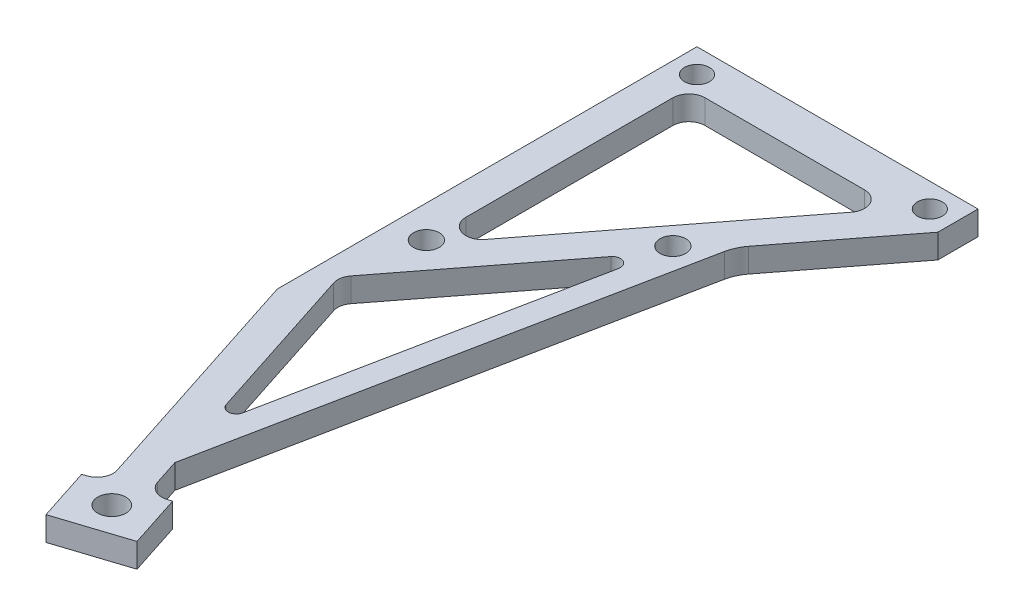
ISO-10303-21;
HEADER;
FILE_DESCRIPTION(('STEP AP214'),'2;1');
FILE_NAME('part.step','',(''),(''),'','','');
FILE_SCHEMA(('AUTOMOTIVE_DESIGN { 1 0 10303 214 1 1 1 1 }'));
ENDSEC;
DATA;
#1=APPLICATION_CONTEXT('core data for automotive mechanical design processes');
#2=APPLICATION_PROTOCOL_DEFINITION('international standard','automotive_design',2000,#1);
#3=PRODUCT_CONTEXT('',#1,'mechanical');
#4=PRODUCT('Part','Part','',(#3));
#5=PRODUCT_RELATED_PRODUCT_CATEGORY('part','',(#4));
#6=PRODUCT_DEFINITION_FORMATION('','',#4);
#7=PRODUCT_DEFINITION_CONTEXT('part definition',#1,'design');
#8=PRODUCT_DEFINITION('design','',#6,#7);
#9=PRODUCT_DEFINITION_SHAPE('','',#8);
#10=(LENGTH_UNIT() NAMED_UNIT(*) SI_UNIT(.MILLI.,.METRE.));
#11=(NAMED_UNIT(*) PLANE_ANGLE_UNIT() SI_UNIT($,.RADIAN.));
#12=(NAMED_UNIT(*) SI_UNIT($,.STERADIAN.) SOLID_ANGLE_UNIT());
#13=UNCERTAINTY_MEASURE_WITH_UNIT(LENGTH_MEASURE(1.E-05),#10,'distance_accuracy_value','');
#14=(GEOMETRIC_REPRESENTATION_CONTEXT(3) GLOBAL_UNCERTAINTY_ASSIGNED_CONTEXT((#13)) GLOBAL_UNIT_ASSIGNED_CONTEXT((#10,
#11,#12)) REPRESENTATION_CONTEXT('',''));
#15=CARTESIAN_POINT('',(0.,0.,0.));
#16=DIRECTION('',(0.,0.,1.));
#17=DIRECTION('',(1.,0.,0.));
#18=AXIS2_PLACEMENT_3D('',#15,#16,#17);
#19=CARTESIAN_POINT('',(50.,0.,4.));
#20=DIRECTION('',(-1.,0.,0.));
#21=DIRECTION('',(0.,0.,1.));
#22=AXIS2_PLACEMENT_3D('',#19,#20,#21);
#23=PLANE('',#22);
#24=DIRECTION('',(0.,0.,1.));
#25=VECTOR('',#24,1.);
#26=CARTESIAN_POINT('',(50.,-5.99999999999999,0.));
#27=LINE('',#26,#25);
#28=CARTESIAN_POINT('',(50.,-5.99999999999999,0.));
#29=VERTEX_POINT('',#28);
#30=CARTESIAN_POINT('',(50.,-5.99999999999999,5.));
#31=VERTEX_POINT('',#30);
#32=EDGE_CURVE('E520',#29,#31,#27,.T.);
#33=ORIENTED_EDGE('',*,*,#32,.F.);
#34=DIRECTION('',(0.,1.,0.));
#35=VECTOR('',#34,1.);
#36=CARTESIAN_POINT('',(50.,-7.001,0.));
#37=LINE('',#36,#35);
#38=CARTESIAN_POINT('',(50.,-3.,0.));
#39=VERTEX_POINT('',#38);
#40=EDGE_CURVE('E571',#29,#39,#37,.T.);
#41=ORIENTED_EDGE('',*,*,#40,.T.);
#42=DIRECTION('',(0.,0.,-1.));
#43=VECTOR('',#42,1.);
#44=CARTESIAN_POINT('',(50.,-3.,3.));
#45=LINE('',#44,#43);
#46=CARTESIAN_POINT('',(50.,-3.,5.));
#47=VERTEX_POINT('',#46);
#48=EDGE_CURVE('E510',#47,#39,#45,.T.);
#49=ORIENTED_EDGE('',*,*,#48,.F.);
#50=DIRECTION('',(0.,1.,0.));
#51=VECTOR('',#50,1.);
#52=CARTESIAN_POINT('',(50.,-25.,5.));
#53=LINE('',#52,#51);
#54=EDGE_CURVE('E508',#31,#47,#53,.T.);
#55=ORIENTED_EDGE('',*,*,#54,.F.);
#56=EDGE_LOOP('',(#33,#41,#49,#55));
#57=FACE_BOUND('',#56,.T.);
#58=ADVANCED_FACE('F224',(#57),#23,.F.);
#59=CARTESIAN_POINT('',(15.,0.,0.));
#60=DIRECTION('',(1.,0.,0.));
#61=DIRECTION('',(0.,0.,-1.));
#62=AXIS2_PLACEMENT_3D('',#59,#60,#61);
#63=PLANE('',#62);
#64=DIRECTION('',(0.,0.,-1.));
#65=VECTOR('',#64,1.);
#66=CARTESIAN_POINT('',(15.,-6.,52.2716704370543));
#67=LINE('',#66,#65);
#68=CARTESIAN_POINT('',(15.,-6.,52.2716704370543));
#69=VERTEX_POINT('',#68);
#70=CARTESIAN_POINT('',(15.,-6.,0.));
#71=VERTEX_POINT('',#70);
#72=EDGE_CURVE('E406',#69,#71,#67,.T.);
#73=ORIENTED_EDGE('',*,*,#72,.F.);
#74=DIRECTION('',(0.,1.,0.));
#75=VECTOR('',#74,1.);
#76=CARTESIAN_POINT('',(15.,0.,52.2716704370543));
#77=LINE('',#76,#75);
#78=CARTESIAN_POINT('',(15.,-3.00000000000001,52.2716704370543));
#79=VERTEX_POINT('',#78);
#80=EDGE_CURVE('E419',#69,#79,#77,.T.);
#81=ORIENTED_EDGE('',*,*,#80,.T.);
#82=DIRECTION('',(0.,0.,-1.));
#83=VECTOR('',#82,1.);
#84=CARTESIAN_POINT('',(15.,-3.,0.));
#85=LINE('',#84,#83);
#86=CARTESIAN_POINT('',(15.,-3.,0.));
#87=VERTEX_POINT('',#86);
#88=EDGE_CURVE('E569',#79,#87,#85,.T.);
#89=ORIENTED_EDGE('',*,*,#88,.T.);
#90=DIRECTION('',(0.,1.,0.));
#91=VECTOR('',#90,1.);
#92=CARTESIAN_POINT('',(15.,-7.00100000000001,0.));
#93=LINE('',#92,#91);
#94=EDGE_CURVE('E421',#71,#87,#93,.T.);
#95=ORIENTED_EDGE('',*,*,#94,.F.);
#96=EDGE_LOOP('',(#73,#81,#89,#95));
#97=FACE_BOUND('',#96,.T.);
#98=ADVANCED_FACE('F417',(#97),#63,.F.);
#99=CARTESIAN_POINT('',(19.,-25.,37.7023454364812));
#100=DIRECTION('',(0.,1.,0.));
#101=DIRECTION('',(0.,0.,1.));
#102=AXIS2_PLACEMENT_3D('',#99,#100,#101);
#103=CYLINDRICAL_SURFACE('',#102,1.6);
#104=CARTESIAN_POINT('',(19.,-3.,37.7023454364812));
#105=DIRECTION('',(0.,-1.,0.));
#106=DIRECTION('',(0.,0.,-1.));
#107=AXIS2_PLACEMENT_3D('',#104,#105,#106);
#108=CIRCLE('',#107,1.6);
#109=CARTESIAN_POINT('',(19.,-3.,36.1023454364812));
#110=VERTEX_POINT('',#109);
#111=EDGE_CURVE('E624',#110,#110,#108,.T.);
#112=ORIENTED_EDGE('',*,*,#111,.F.);
#113=EDGE_LOOP('',(#112));
#114=FACE_BOUND('',#113,.T.);
#115=CARTESIAN_POINT('',(19.,-6.,37.7023454364812));
#116=DIRECTION('',(0.,-1.,0.));
#117=DIRECTION('',(1.,0.,0.));
#118=AXIS2_PLACEMENT_3D('',#115,#116,#117);
#119=CIRCLE('',#118,1.6);
#120=CARTESIAN_POINT('',(20.6,-6.,37.7023454364812));
#121=VERTEX_POINT('',#120);
#122=EDGE_CURVE('E566',#121,#121,#119,.F.);
#123=ORIENTED_EDGE('',*,*,#122,.F.);
#124=EDGE_LOOP('',(#123));
#125=FACE_BOUND('',#124,.T.);
#126=ADVANCED_FACE('F675',(#114,#125),#103,.F.);
#127=CARTESIAN_POINT('',(33.7646666701016,-25.,26.0463504212863));
#128=DIRECTION('',(0.791789946491999,0.,0.61079348443987));
#129=DIRECTION('',(0.61079348443987,0.,-0.791789946491999));
#130=AXIS2_PLACEMENT_3D('',#127,#128,#129);
#131=PLANE('',#130);
#132=DIRECTION('',(0.,1.,0.));
#133=VECTOR('',#132,1.);
#134=CARTESIAN_POINT('',(18.1710558588833,-25.,46.2608166596653));
#135=LINE('',#134,#133);
#136=CARTESIAN_POINT('',(18.1710558588833,-3.00000000000001,46.2608166596653));
#137=VERTEX_POINT('',#136);
#138=CARTESIAN_POINT('',(18.1710558588833,-6.,46.2608166596653));
#139=VERTEX_POINT('',#138);
#140=EDGE_CURVE('E446',#137,#139,#135,.F.);
#141=ORIENTED_EDGE('',*,*,#140,.T.);
#142=DIRECTION('',(0.61079348443987,0.,-0.791789946491999));
#143=VECTOR('',#142,1.);
#144=CARTESIAN_POINT('',(33.7646666701016,-5.99999999999999,26.0463504212863));
#145=LINE('',#144,#143);
#146=CARTESIAN_POINT('',(32.2687076713488,-5.99999999999999,27.9856070206963));
#147=VERTEX_POINT('',#146);
#148=EDGE_CURVE('E541',#139,#147,#145,.T.);
#149=ORIENTED_EDGE('',*,*,#148,.T.);
#150=DIRECTION('',(0.,1.,0.));
#151=VECTOR('',#150,1.);
#152=CARTESIAN_POINT('',(32.2687076713489,-25.,27.9856070206963));
#153=LINE('',#152,#151);
#154=CARTESIAN_POINT('',(32.2687076713489,-3.,27.9856070206963));
#155=VERTEX_POINT('',#154);
#156=EDGE_CURVE('E478',#147,#155,#153,.T.);
#157=ORIENTED_EDGE('',*,*,#156,.T.);
#158=DIRECTION('',(-0.61079348443987,0.,0.791789946491999));
#159=VECTOR('',#158,1.);
#160=CARTESIAN_POINT('',(52.0864463226272,-3.,2.29527694018147));
#161=LINE('',#160,#159);
#162=EDGE_CURVE('E429',#155,#137,#161,.T.);
#163=ORIENTED_EDGE('',*,*,#162,.T.);
#164=EDGE_LOOP('',(#141,#149,#157,#163));
#165=FACE_BOUND('',#164,.T.);
#166=ADVANCED_FACE('F646',(#165),#131,.T.);
#167=CARTESIAN_POINT('',(38.2824574385167,-25.,7.69686602742777));
#168=DIRECTION('',(0.980381333659903,0.,0.197110224522296));
#169=DIRECTION('',(0.197110224522296,0.,-0.980381333659903));
#170=AXIS2_PLACEMENT_3D('',#167,#168,#169);
#171=PLANE('',#170);
#172=DIRECTION('',(0.197110224522296,0.,-0.980381333659903));
#173=VECTOR('',#172,1.);
#174=CARTESIAN_POINT('',(38.2824574385167,-5.99999999999999,7.69686602742777));
#175=LINE('',#174,#173);
#176=CARTESIAN_POINT('',(26.2019769452932,-6.,67.7824227554055));
#177=VERTEX_POINT('',#176);
#178=CARTESIAN_POINT('',(34.0408789515008,-5.99999999999999,28.7935107296585));
#179=VERTEX_POINT('',#178);
#180=EDGE_CURVE('E248',#177,#179,#175,.T.);
#181=ORIENTED_EDGE('',*,*,#180,.F.);
#182=DIRECTION('',(0.,1.,0.));
#183=VECTOR('',#182,1.);
#184=CARTESIAN_POINT('',(26.2019769452932,-3.00000000000001,67.7824227554055));
#185=LINE('',#184,#183);
#186=CARTESIAN_POINT('',(26.2019769452932,-3.00000000000001,67.7824227554055));
#187=VERTEX_POINT('',#186);
#188=EDGE_CURVE('E476',#177,#187,#185,.T.);
#189=ORIENTED_EDGE('',*,*,#188,.T.);
#190=DIRECTION('',(-0.197110224522296,0.,0.980381333659903));
#191=VECTOR('',#190,1.);
#192=CARTESIAN_POINT('',(39.7619072365263,-3.,0.338419911450018));
#193=LINE('',#192,#191);
#194=CARTESIAN_POINT('',(34.0408789515008,-3.,28.7935107296585));
#195=VERTEX_POINT('',#194);
#196=EDGE_CURVE('E433',#195,#187,#193,.T.);
#197=ORIENTED_EDGE('',*,*,#196,.F.);
#198=DIRECTION('',(0.,1.,0.));
#199=VECTOR('',#198,1.);
#200=CARTESIAN_POINT('',(34.0408789515008,-25.,28.7935107296585));
#201=LINE('',#200,#199);
#202=EDGE_CURVE('E473',#195,#179,#201,.F.);
#203=ORIENTED_EDGE('',*,*,#202,.T.);
#204=EDGE_LOOP('',(#181,#189,#197,#203));
#205=FACE_BOUND('',#204,.T.);
#206=ADVANCED_FACE('F638',(#205),#171,.F.);
#207=CARTESIAN_POINT('',(2.04167898312241,-25.,-0.661998641416045));
#208=DIRECTION('',(-0.951245719925072,0.,0.308434077760925));
#209=DIRECTION('',(0.308434077760925,0.,0.951245719925072));
#210=AXIS2_PLACEMENT_3D('',#207,#208,#209);
#211=PLANE('',#210);
#212=DIRECTION('',(0.308434077760925,0.,0.951245719925072));
#213=VECTOR('',#212,1.);
#214=CARTESIAN_POINT('',(2.04167898312241,-6.,-0.661998641416045));
#215=LINE('',#214,#213);
#216=CARTESIAN_POINT('',(17.8521443120172,-6.,48.0992717840668));
#217=VERTEX_POINT('',#216);
#218=CARTESIAN_POINT('',(24.2703498917083,-6.,67.8937466086442));
#219=VERTEX_POINT('',#218);
#220=EDGE_CURVE('E548',#217,#219,#215,.T.);
#221=ORIENTED_EDGE('',*,*,#220,.F.);
#222=DIRECTION('',(0.,1.,0.));
#223=VECTOR('',#222,1.);
#224=CARTESIAN_POINT('',(17.8521443120172,-25.,48.0992717840668));
#225=LINE('',#224,#223);
#226=CARTESIAN_POINT('',(17.8521443120172,-3.,48.0992717840669));
#227=VERTEX_POINT('',#226);
#228=EDGE_CURVE('E444',#217,#227,#225,.T.);
#229=ORIENTED_EDGE('',*,*,#228,.T.);
#230=DIRECTION('',(-0.308434077760925,0.,-0.951245719925072));
#231=VECTOR('',#230,1.);
#232=CARTESIAN_POINT('',(7.96384252935408,-3.,17.6026262241144));
#233=LINE('',#232,#231);
#234=CARTESIAN_POINT('',(24.2703498917083,-3.00000000000001,67.8937466086442));
#235=VERTEX_POINT('',#234);
#236=EDGE_CURVE('E627',#235,#227,#233,.T.);
#237=ORIENTED_EDGE('',*,*,#236,.F.);
#238=DIRECTION('',(0.,1.,0.));
#239=VECTOR('',#238,1.);
#240=CARTESIAN_POINT('',(24.2703498917083,-7.00000000000001,67.8937466086442));
#241=LINE('',#240,#239);
#242=EDGE_CURVE('E470',#235,#219,#241,.F.);
#243=ORIENTED_EDGE('',*,*,#242,.T.);
#244=EDGE_LOOP('',(#221,#229,#237,#243));
#245=FACE_BOUND('',#244,.T.);
#246=ADVANCED_FACE('F655',(#245),#211,.F.);
#247=CARTESIAN_POINT('',(19.,-25.,0.));
#248=DIRECTION('',(1.,0.,0.));
#249=DIRECTION('',(0.,0.,-1.));
#250=AXIS2_PLACEMENT_3D('',#247,#248,#249);
#251=PLANE('',#250);
#252=DIRECTION('',(0.,1.,0.));
#253=VECTOR('',#252,1.);
#254=CARTESIAN_POINT('',(19.,-25.,32.7702838690608));
#255=LINE('',#254,#253);
#256=CARTESIAN_POINT('',(19.,-6.,32.7702838690608));
#257=VERTEX_POINT('',#256);
#258=CARTESIAN_POINT('',(19.,-3.,32.7702838690608));
#259=VERTEX_POINT('',#258);
#260=EDGE_CURVE('E588',#257,#259,#255,.T.);
#261=ORIENTED_EDGE('',*,*,#260,.F.);
#262=DIRECTION('',(0.,0.,-1.));
#263=VECTOR('',#262,1.);
#264=CARTESIAN_POINT('',(19.,-6.,0.));
#265=LINE('',#264,#263);
#266=CARTESIAN_POINT('',(19.,-6.,7.));
#267=VERTEX_POINT('',#266);
#268=EDGE_CURVE('E553',#257,#267,#265,.T.);
#269=ORIENTED_EDGE('',*,*,#268,.T.);
#270=DIRECTION('',(0.,1.,0.));
#271=VECTOR('',#270,1.);
#272=CARTESIAN_POINT('',(19.,-3.,7.));
#273=LINE('',#272,#271);
#274=CARTESIAN_POINT('',(19.,-3.,7.));
#275=VERTEX_POINT('',#274);
#276=EDGE_CURVE('E457',#267,#275,#273,.T.);
#277=ORIENTED_EDGE('',*,*,#276,.T.);
#278=DIRECTION('',(0.,0.,1.));
#279=VECTOR('',#278,1.);
#280=CARTESIAN_POINT('',(19.,-3.,3.));
#281=LINE('',#280,#279);
#282=EDGE_CURVE('E608',#275,#259,#281,.T.);
#283=ORIENTED_EDGE('',*,*,#282,.T.);
#284=EDGE_LOOP('',(#261,#269,#277,#283));
#285=FACE_BOUND('',#284,.T.);
#286=ADVANCED_FACE('F715',(#285),#251,.T.);
#287=CARTESIAN_POINT('',(0.,-25.,5.));
#288=DIRECTION('',(0.,0.,1.));
#289=DIRECTION('',(1.,0.,0.));
#290=AXIS2_PLACEMENT_3D('',#287,#288,#289);
#291=PLANE('',#290);
#292=DIRECTION('',(0.,1.,0.));
#293=VECTOR('',#292,1.);
#294=CARTESIAN_POINT('',(21.,-7.,5.));
#295=LINE('',#294,#293);
#296=CARTESIAN_POINT('',(21.,-3.,5.));
#297=VERTEX_POINT('',#296);
#298=CARTESIAN_POINT('',(21.,-6.,5.));
#299=VERTEX_POINT('',#298);
#300=EDGE_CURVE('E449',#297,#299,#295,.F.);
#301=ORIENTED_EDGE('',*,*,#300,.T.);
#302=DIRECTION('',(1.,0.,0.));
#303=VECTOR('',#302,1.);
#304=CARTESIAN_POINT('',(0.,-6.,5.));
#305=LINE('',#304,#303);
#306=CARTESIAN_POINT('',(40.8794156823097,-6.,5.));
#307=VERTEX_POINT('',#306);
#308=EDGE_CURVE('E240',#299,#307,#305,.T.);
#309=ORIENTED_EDGE('',*,*,#308,.T.);
#310=DIRECTION('',(0.,1.,0.));
#311=VECTOR('',#310,1.);
#312=CARTESIAN_POINT('',(40.8794156823097,-3.00000000000001,5.));
#313=LINE('',#312,#311);
#314=CARTESIAN_POINT('',(40.8794156823097,-3.,5.));
#315=VERTEX_POINT('',#314);
#316=EDGE_CURVE('E452',#307,#315,#313,.T.);
#317=ORIENTED_EDGE('',*,*,#316,.T.);
#318=DIRECTION('',(-1.,0.,0.));
#319=VECTOR('',#318,1.);
#320=CARTESIAN_POINT('',(53.,-3.,5.));
#321=LINE('',#320,#319);
#322=EDGE_CURVE('E605',#315,#297,#321,.T.);
#323=ORIENTED_EDGE('',*,*,#322,.T.);
#324=EDGE_LOOP('',(#301,#309,#317,#323));
#325=FACE_BOUND('',#324,.T.);
#326=ADVANCED_FACE('F710',(#325),#291,.T.);
#327=CARTESIAN_POINT('',(30.5975068841336,-25.,23.6031764835268));
#328=DIRECTION('',(-0.791789946491999,0.,-0.61079348443987));
#329=DIRECTION('',(-0.61079348443987,0.,0.791789946491999));
#330=AXIS2_PLACEMENT_3D('',#327,#328,#329);
#331=PLANE('',#330);
#332=DIRECTION('',(0.,1.,0.));
#333=VECTOR('',#332,1.);
#334=CARTESIAN_POINT('',(42.4629955752937,-7.,8.22158696887974));
#335=LINE('',#334,#333);
#336=CARTESIAN_POINT('',(42.4629955752937,-3.,8.22158696887974));
#337=VERTEX_POINT('',#336);
#338=CARTESIAN_POINT('',(42.4629955752937,-5.99999999999999,8.22158696887974));
#339=VERTEX_POINT('',#338);
#340=EDGE_CURVE('E454',#337,#339,#335,.F.);
#341=ORIENTED_EDGE('',*,*,#340,.T.);
#342=DIRECTION('',(-0.61079348443987,0.,0.791789946491999));
#343=VECTOR('',#342,1.);
#344=CARTESIAN_POINT('',(30.5975068841336,-5.99999999999999,23.6031764835268));
#345=LINE('',#344,#343);
#346=CARTESIAN_POINT('',(22.583579892984,-6.,33.9918708379405));
#347=VERTEX_POINT('',#346);
#348=EDGE_CURVE('E560',#339,#347,#345,.T.);
#349=ORIENTED_EDGE('',*,*,#348,.T.);
#350=DIRECTION('',(0.,1.,0.));
#351=VECTOR('',#350,1.);
#352=CARTESIAN_POINT('',(22.583579892984,-25.,33.9918708379405));
#353=LINE('',#352,#351);
#354=CARTESIAN_POINT('',(22.583579892984,-3.,33.9918708379405));
#355=VERTEX_POINT('',#354);
#356=EDGE_CURVE('E596',#347,#355,#353,.T.);
#357=ORIENTED_EDGE('',*,*,#356,.T.);
#358=DIRECTION('',(0.61079348443987,0.,-0.791789946491999));
#359=VECTOR('',#358,1.);
#360=CARTESIAN_POINT('',(48.9192865366592,-3.,-0.147896997578012));
#361=LINE('',#360,#359);
#362=EDGE_CURVE('E602',#355,#337,#361,.T.);
#363=ORIENTED_EDGE('',*,*,#362,.T.);
#364=EDGE_LOOP('',(#341,#349,#357,#363));
#365=FACE_BOUND('',#364,.T.);
#366=ADVANCED_FACE('F700',(#365),#331,.T.);
#367=CARTESIAN_POINT('',(21.,-25.,32.7702838690608));
#368=DIRECTION('',(0.,1.,0.));
#369=DIRECTION('',(0.,0.,1.));
#370=AXIS2_PLACEMENT_3D('',#367,#368,#369);
#371=CYLINDRICAL_SURFACE('',#370,2.);
#372=CARTESIAN_POINT('',(21.,-6.,32.7702838690608));
#373=DIRECTION('',(0.,-1.,0.));
#374=DIRECTION('',(1.,0.,0.));
#375=AXIS2_PLACEMENT_3D('',#372,#373,#374);
#376=CIRCLE('',#375,2.);
#377=EDGE_CURVE('E558',#257,#347,#376,.F.);
#378=ORIENTED_EDGE('',*,*,#377,.F.);
#379=ORIENTED_EDGE('',*,*,#260,.T.);
#380=CARTESIAN_POINT('',(21.,-3.,32.7702838690608));
#381=DIRECTION('',(0.,-1.,0.));
#382=DIRECTION('',(0.,0.,-1.));
#383=AXIS2_PLACEMENT_3D('',#380,#381,#382);
#384=CIRCLE('',#383,2.);
#385=EDGE_CURVE('E598',#355,#259,#384,.T.);
#386=ORIENTED_EDGE('',*,*,#385,.F.);
#387=ORIENTED_EDGE('',*,*,#356,.F.);
#388=EDGE_LOOP('',(#378,#379,#386,#387));
#389=FACE_BOUND('',#388,.T.);
#390=ADVANCED_FACE('F717',(#389),#371,.F.);
#391=CARTESIAN_POINT('',(29.0706472211607,-25.,89.65717713597));
#392=DIRECTION('',(0.308434077760924,0.,0.951245719925072));
#393=DIRECTION('',(0.951245719925072,0.,-0.308434077760924));
#394=AXIS2_PLACEMENT_3D('',#391,#392,#393);
#395=PLANE('',#394);
#396=DIRECTION('',(0.,1.,0.));
#397=VECTOR('',#396,1.);
#398=CARTESIAN_POINT('',(24.9292290247701,-25.,91.));
#399=LINE('',#398,#397);
#400=CARTESIAN_POINT('',(24.9292290247701,-6.,91.));
#401=VERTEX_POINT('',#400);
#402=CARTESIAN_POINT('',(24.9292290247701,-3.00000000000001,91.));
#403=VERTEX_POINT('',#402);
#404=EDGE_CURVE('E586',#401,#403,#399,.T.);
#405=ORIENTED_EDGE('',*,*,#404,.F.);
#406=DIRECTION('',(-0.951245719925072,0.,0.308434077760924));
#407=VECTOR('',#406,1.);
#408=CARTESIAN_POINT('',(33.4904405040957,-6.,88.2240933001517));
#409=LINE('',#408,#407);
#410=CARTESIAN_POINT('',(33.4904405040957,-6.,88.2240933001517));
#411=VERTEX_POINT('',#410);
#412=EDGE_CURVE('E531',#411,#401,#409,.T.);
#413=ORIENTED_EDGE('',*,*,#412,.F.);
#414=DIRECTION('',(0.,1.,0.));
#415=VECTOR('',#414,1.);
#416=CARTESIAN_POINT('',(33.4904405040957,-25.,88.2240933001517));
#417=LINE('',#416,#415);
#418=CARTESIAN_POINT('',(33.4904405040957,-3.00000000000001,88.2240933001517));
#419=VERTEX_POINT('',#418);
#420=EDGE_CURVE('E593',#411,#419,#417,.T.);
#421=ORIENTED_EDGE('',*,*,#420,.T.);
#422=DIRECTION('',(-0.951245719925072,0.,0.308434077760924));
#423=VECTOR('',#422,1.);
#424=CARTESIAN_POINT('',(76.148483674929,-3.00000000000001,74.3925522704396));
#425=LINE('',#424,#423);
#426=EDGE_CURVE('E621',#419,#403,#425,.T.);
#427=ORIENTED_EDGE('',*,*,#426,.T.);
#428=EDGE_LOOP('',(#405,#413,#421,#427));
#429=FACE_BOUND('',#428,.T.);
#430=ADVANCED_FACE('F719',(#429),#395,.T.);
#431=CARTESIAN_POINT('',(4.41979328293524,-25.,-1.43308383581839));
#432=DIRECTION('',(0.951245719925072,0.,-0.308434077760923));
#433=DIRECTION('',(-0.308434077760923,0.,-0.951245719925072));
#434=AXIS2_PLACEMENT_3D('',#431,#432,#433);
#435=PLANE('',#434);
#436=ORIENTED_EDGE('',*,*,#420,.F.);
#437=DIRECTION('',(0.308434077760923,0.,0.951245719925072));
#438=VECTOR('',#437,1.);
#439=CARTESIAN_POINT('',(31.3614217456235,-6.,81.6579576891356));
#440=LINE('',#439,#438);
#441=CARTESIAN_POINT('',(31.3614217456235,-6.,81.6579576891356));
#442=VERTEX_POINT('',#441);
#443=EDGE_CURVE('E529',#442,#411,#440,.T.);
#444=ORIENTED_EDGE('',*,*,#443,.F.);
#445=DIRECTION('',(0.,1.,0.));
#446=VECTOR('',#445,1.);
#447=CARTESIAN_POINT('',(31.3614217456235,-25.,81.6579576891356));
#448=LINE('',#447,#446);
#449=CARTESIAN_POINT('',(31.3614217456235,-3.00000000000001,81.6579576891356));
#450=VERTEX_POINT('',#449);
#451=EDGE_CURVE('E591',#442,#450,#448,.T.);
#452=ORIENTED_EDGE('',*,*,#451,.T.);
#453=DIRECTION('',(0.308434077760923,0.,0.951245719925072));
#454=VECTOR('',#453,1.);
#455=CARTESIAN_POINT('',(10.3419568291668,-3.,16.831541029712));
#456=LINE('',#455,#454);
#457=EDGE_CURVE('E618',#450,#419,#456,.T.);
#458=ORIENTED_EDGE('',*,*,#457,.T.);
#459=EDGE_LOOP('',(#436,#444,#452,#458));
#460=FACE_BOUND('',#459,.T.);
#461=ADVANCED_FACE('F725',(#460),#435,.T.);
#462=CARTESIAN_POINT('',(26.9416284626886,-25.,83.0910415249539));
#463=DIRECTION('',(0.308434077760926,0.,0.951245719925071));
#464=DIRECTION('',(0.951245719925071,0.,-0.308434077760926));
#465=AXIS2_PLACEMENT_3D('',#462,#463,#464);
#466=PLANE('',#465);
#467=DIRECTION('',(0.951245719925071,0.,-0.308434077760928));
#468=VECTOR('',#467,1.);
#469=CARTESIAN_POINT('',(30.885798885661,-6.,81.8121747280161));
#470=LINE('',#469,#468);
#471=CARTESIAN_POINT('',(30.885798885661,-6.,81.8121747280161));
#472=VERTEX_POINT('',#471);
#473=EDGE_CURVE('E527',#472,#442,#470,.T.);
#474=ORIENTED_EDGE('',*,*,#473,.F.);
#475=DIRECTION('',(0.,1.,0.));
#476=VECTOR('',#475,1.);
#477=CARTESIAN_POINT('',(30.885798885661,-3.00000000000001,81.8121747280161));
#478=LINE('',#477,#476);
#479=CARTESIAN_POINT('',(30.885798885661,-3.00000000000001,81.8121747280161));
#480=VERTEX_POINT('',#479);
#481=EDGE_CURVE('E428',#472,#480,#478,.T.);
#482=ORIENTED_EDGE('',*,*,#481,.T.);
#483=DIRECTION('',(-0.951245719925071,0.,0.308434077760926));
#484=VECTOR('',#483,1.);
#485=CARTESIAN_POINT('',(74.0194649164569,-3.00000000000001,67.8264166594234));
#486=LINE('',#485,#484);
#487=EDGE_CURVE('E615',#450,#480,#486,.T.);
#488=ORIENTED_EDGE('',*,*,#487,.F.);
#489=ORIENTED_EDGE('',*,*,#451,.F.);
#490=EDGE_LOOP('',(#474,#482,#488,#489));
#491=FACE_BOUND('',#490,.T.);
#492=ADVANCED_FACE('F798',(#491),#466,.F.);
#493=CARTESIAN_POINT('',(2.0416789831224,-25.,-0.66199864141604));
#494=DIRECTION('',(-0.951245719925071,0.,0.308434077760925));
#495=DIRECTION('',(0.308434077760925,0.,0.951245719925072));
#496=AXIS2_PLACEMENT_3D('',#493,#494,#495);
#497=PLANE('',#496);
#498=DIRECTION('',(0.308434077760927,0.,0.951245719925071));
#499=VECTOR('',#498,1.);
#500=CARTESIAN_POINT('',(27.337663152919,-6.,77.353689013769));
#501=LINE('',#500,#499);
#502=CARTESIAN_POINT('',(27.337663152919,-6.,77.353689013769));
#503=VERTEX_POINT('',#502);
#504=CARTESIAN_POINT('',(28.3664392902891,-6.,80.5265514436878));
#505=VERTEX_POINT('',#504);
#506=EDGE_CURVE('E518',#503,#505,#501,.T.);
#507=ORIENTED_EDGE('',*,*,#506,.F.);
#508=DIRECTION('',(0.,1.,0.));
#509=VECTOR('',#508,1.);
#510=CARTESIAN_POINT('',(27.337663152919,-25.,77.353689013769));
#511=LINE('',#510,#509);
#512=CARTESIAN_POINT('',(27.337663152919,-3.00000000000001,77.353689013769));
#513=VERTEX_POINT('',#512);
#514=EDGE_CURVE('E589',#503,#513,#511,.T.);
#515=ORIENTED_EDGE('',*,*,#514,.T.);
#516=DIRECTION('',(-0.308434077760925,0.,-0.951245719925072));
#517=VECTOR('',#516,1.);
#518=CARTESIAN_POINT('',(7.96384252935407,-3.,17.6026262241144));
#519=LINE('',#518,#517);
#520=CARTESIAN_POINT('',(28.3664392902891,-3.00000000000001,80.5265514436878));
#521=VERTEX_POINT('',#520);
#522=EDGE_CURVE('E613',#521,#513,#519,.T.);
#523=ORIENTED_EDGE('',*,*,#522,.F.);
#524=DIRECTION('',(0.,1.,0.));
#525=VECTOR('',#524,1.);
#526=CARTESIAN_POINT('',(28.366439290289,-7.,80.5265514436878));
#527=LINE('',#526,#525);
#528=EDGE_CURVE('E431',#521,#505,#527,.F.);
#529=ORIENTED_EDGE('',*,*,#528,.T.);
#530=EDGE_LOOP('',(#507,#515,#523,#529));
#531=FACE_BOUND('',#530,.T.);
#532=ADVANCED_FACE('F808',(#531),#497,.F.);
#533=CARTESIAN_POINT('',(41.2236014394964,-25.,8.28819670099466));
#534=DIRECTION('',(0.980381333659903,0.,0.197110224522296));
#535=DIRECTION('',(0.197110224522296,0.,-0.980381333659903));
#536=AXIS2_PLACEMENT_3D('',#533,#534,#535);
#537=PLANE('',#536);
#538=ORIENTED_EDGE('',*,*,#514,.F.);
#539=DIRECTION('',(-0.197110224522296,0.,0.980381333659903));
#540=VECTOR('',#539,1.);
#541=CARTESIAN_POINT('',(38.7939383090199,-6.,20.3727873708784));
#542=LINE('',#541,#540);
#543=CARTESIAN_POINT('',(38.7939383090199,-6.,20.3727873708784));
#544=VERTEX_POINT('',#543);
#545=EDGE_CURVE('E515',#544,#503,#542,.T.);
#546=ORIENTED_EDGE('',*,*,#545,.F.);
#547=DIRECTION('',(0.,1.,0.));
#548=VECTOR('',#547,1.);
#549=CARTESIAN_POINT('',(38.7939383090199,-3.,20.3727873708784));
#550=LINE('',#549,#548);
#551=CARTESIAN_POINT('',(38.7939383090199,-3.,20.3727873708784));
#552=VERTEX_POINT('',#551);
#553=EDGE_CURVE('E484',#544,#552,#550,.T.);
#554=ORIENTED_EDGE('',*,*,#553,.T.);
#555=DIRECTION('',(-0.197110224522296,0.,0.980381333659903));
#556=VECTOR('',#555,1.);
#557=CARTESIAN_POINT('',(42.703051237506,-3.,0.929750585016903));
#558=LINE('',#557,#556);
#559=EDGE_CURVE('E500',#552,#513,#558,.T.);
#560=ORIENTED_EDGE('',*,*,#559,.T.);
#561=EDGE_LOOP('',(#538,#546,#554,#560));
#562=FACE_BOUND('',#561,.T.);
#563=ADVANCED_FACE('F818',(#562),#537,.T.);
#564=CARTESIAN_POINT('',(33.7646666701016,-25.,26.0463504212863));
#565=DIRECTION('',(0.791789946491998,0.,0.610793484439871));
#566=DIRECTION('',(0.610793484439871,0.,-0.791789946491998));
#567=AXIS2_PLACEMENT_3D('',#564,#565,#566);
#568=PLANE('',#567);
#569=DIRECTION('',(0.,1.,0.));
#570=VECTOR('',#569,1.);
#571=CARTESIAN_POINT('',(39.7368952448594,-7.,18.3043710712905));
#572=LINE('',#571,#570);
#573=CARTESIAN_POINT('',(39.7368952448594,-3.,18.3043710712905));
#574=VERTEX_POINT('',#573);
#575=CARTESIAN_POINT('',(39.7368952448594,-5.99999999999999,18.3043710712905));
#576=VERTEX_POINT('',#575);
#577=EDGE_CURVE('E486',#574,#576,#572,.F.);
#578=ORIENTED_EDGE('',*,*,#577,.T.);
#579=DIRECTION('',(-0.610793484439871,0.,0.791789946491998));
#580=VECTOR('',#579,1.);
#581=CARTESIAN_POINT('',(50.,-5.99999999999999,5.));
#582=LINE('',#581,#580);
#583=EDGE_CURVE('E516',#31,#576,#582,.T.);
#584=ORIENTED_EDGE('',*,*,#583,.F.);
#585=ORIENTED_EDGE('',*,*,#54,.T.);
#586=DIRECTION('',(-0.610793484439871,0.,0.791789946491998));
#587=VECTOR('',#586,1.);
#588=CARTESIAN_POINT('',(52.0864463226272,-3.,2.29527694018148));
#589=LINE('',#588,#587);
#590=EDGE_CURVE('E497',#47,#574,#589,.T.);
#591=ORIENTED_EDGE('',*,*,#590,.T.);
#592=EDGE_LOOP('',(#578,#584,#585,#591));
#593=FACE_BOUND('',#592,.T.);
#594=ADVANCED_FACE('F505',(#593),#568,.T.);
#595=CARTESIAN_POINT('',(26.9416284626886,-25.,83.0910415249539));
#596=DIRECTION('',(0.308434077760926,0.,0.951245719925071));
#597=DIRECTION('',(0.951245719925071,0.,-0.308434077760926));
#598=AXIS2_PLACEMENT_3D('',#595,#596,#597);
#599=PLANE('',#598);
#600=DIRECTION('',(0.951245719925073,0.,-0.308434077760921));
#601=VECTOR('',#600,1.);
#602=CARTESIAN_POINT('',(22.8002102662978,-6.,84.433864388984));
#603=LINE('',#602,#601);
#604=CARTESIAN_POINT('',(22.8002102662978,-6.,84.433864388984));
#605=VERTEX_POINT('',#604);
#606=CARTESIAN_POINT('',(23.2758331262604,-6.,84.2796473501035));
#607=VERTEX_POINT('',#606);
#608=EDGE_CURVE('E535',#605,#607,#603,.T.);
#609=ORIENTED_EDGE('',*,*,#608,.F.);
#610=DIRECTION('',(0.,1.,0.));
#611=VECTOR('',#610,1.);
#612=CARTESIAN_POINT('',(22.8002102662978,-25.,84.433864388984));
#613=LINE('',#612,#611);
#614=CARTESIAN_POINT('',(22.8002102662978,-3.00000000000001,84.433864388984));
#615=VERTEX_POINT('',#614);
#616=EDGE_CURVE('E577',#605,#615,#613,.T.);
#617=ORIENTED_EDGE('',*,*,#616,.T.);
#618=DIRECTION('',(-0.951245719925071,0.,0.308434077760926));
#619=VECTOR('',#618,1.);
#620=CARTESIAN_POINT('',(74.0194649164569,-3.00000000000001,67.8264166594234));
#621=LINE('',#620,#619);
#622=CARTESIAN_POINT('',(23.2758331262604,-3.00000000000001,84.2796473501035));
#623=VERTEX_POINT('',#622);
#624=EDGE_CURVE('E583',#623,#615,#621,.T.);
#625=ORIENTED_EDGE('',*,*,#624,.F.);
#626=DIRECTION('',(0.,1.,0.));
#627=VECTOR('',#626,1.);
#628=CARTESIAN_POINT('',(23.2758331262604,-7.,84.2796473501035));
#629=LINE('',#628,#627);
#630=EDGE_CURVE('E441',#623,#607,#629,.F.);
#631=ORIENTED_EDGE('',*,*,#630,.T.);
#632=EDGE_LOOP('',(#609,#617,#625,#631));
#633=FACE_BOUND('',#632,.T.);
#634=ADVANCED_FACE('F837',(#633),#599,.F.);
#635=CARTESIAN_POINT('',(-1.76330389657796,-25.,0.571737669627683));
#636=DIRECTION('',(0.951245719925071,0.,-0.308434077760925));
#637=DIRECTION('',(-0.308434077760925,0.,-0.951245719925072));
#638=AXIS2_PLACEMENT_3D('',#635,#636,#637);
#639=PLANE('',#638);
#640=DIRECTION('',(-0.308434077760925,0.,-0.951245719925071));
#641=VECTOR('',#640,1.);
#642=CARTESIAN_POINT('',(24.5614564105887,-6.,81.7602877547315));
#643=LINE('',#642,#641);
#644=CARTESIAN_POINT('',(24.5614564105887,-6.,81.7602877547315));
#645=VERTEX_POINT('',#644);
#646=EDGE_CURVE('E403',#645,#69,#643,.T.);
#647=ORIENTED_EDGE('',*,*,#646,.F.);
#648=DIRECTION('',(0.,1.,0.));
#649=VECTOR('',#648,1.);
#650=CARTESIAN_POINT('',(24.5614564105887,-3.00000000000001,81.7602877547315));
#651=LINE('',#650,#649);
#652=CARTESIAN_POINT('',(24.5614564105887,-3.00000000000001,81.7602877547315));
#653=VERTEX_POINT('',#652);
#654=EDGE_CURVE('E439',#645,#653,#651,.T.);
#655=ORIENTED_EDGE('',*,*,#654,.T.);
#656=DIRECTION('',(0.308434077760925,0.,0.951245719925072));
#657=VECTOR('',#656,1.);
#658=CARTESIAN_POINT('',(4.15885964965372,-3.,18.8363625351582));
#659=LINE('',#658,#657);
#660=EDGE_CURVE('E426',#79,#653,#659,.T.);
#661=ORIENTED_EDGE('',*,*,#660,.F.);
#662=ORIENTED_EDGE('',*,*,#80,.F.);
#663=EDGE_LOOP('',(#647,#655,#661,#662));
#664=FACE_BOUND('',#663,.T.);
#665=ADVANCED_FACE('F424',(#664),#639,.F.);
#666=CARTESIAN_POINT('',(-4.14141819639072,-25.,1.34282286403003));
#667=DIRECTION('',(0.951245719925071,0.,-0.308434077760926));
#668=DIRECTION('',(-0.308434077760926,0.,-0.951245719925071));
#669=AXIS2_PLACEMENT_3D('',#666,#667,#668);
#670=PLANE('',#669);
#671=DIRECTION('',(-0.308434077760927,0.,-0.951245719925071));
#672=VECTOR('',#671,1.);
#673=CARTESIAN_POINT('',(24.9292290247701,-6.,91.));
#674=LINE('',#673,#672);
#675=EDGE_CURVE('E533',#401,#605,#674,.T.);
#676=ORIENTED_EDGE('',*,*,#675,.F.);
#677=ORIENTED_EDGE('',*,*,#404,.T.);
#678=DIRECTION('',(0.308434077760926,0.,0.951245719925071));
#679=VECTOR('',#678,1.);
#680=CARTESIAN_POINT('',(1.78074534984098,-3.,19.6074477295606));
#681=LINE('',#680,#679);
#682=EDGE_CURVE('E579',#615,#403,#681,.T.);
#683=ORIENTED_EDGE('',*,*,#682,.F.);
#684=ORIENTED_EDGE('',*,*,#616,.F.);
#685=EDGE_LOOP('',(#676,#677,#683,#684));
#686=FACE_BOUND('',#685,.T.);
#687=ADVANCED_FACE('F855',(#686),#670,.F.);
#688=CARTESIAN_POINT('',(28.,25.,85.8807788542541));
#689=DIRECTION('',(0.,-1.,0.));
#690=DIRECTION('',(0.,0.,-1.));
#691=AXIS2_PLACEMENT_3D('',#688,#689,#690);
#692=CYLINDRICAL_SURFACE('',#691,1.75);
#693=CARTESIAN_POINT('',(28.,-3.00000000000001,85.8807788542541));
#694=DIRECTION('',(0.,-1.,0.));
#695=DIRECTION('',(0.,0.,-1.));
#696=AXIS2_PLACEMENT_3D('',#693,#694,#695);
#697=CIRCLE('',#696,1.75);
#698=CARTESIAN_POINT('',(28.,-3.00000000000001,84.1307788542541));
#699=VERTEX_POINT('',#698);
#700=EDGE_CURVE('E573',#699,#699,#697,.T.);
#701=ORIENTED_EDGE('',*,*,#700,.F.);
#702=EDGE_LOOP('',(#701));
#703=FACE_BOUND('',#702,.T.);
#704=CARTESIAN_POINT('',(28.,-6.,85.8807788542541));
#705=DIRECTION('',(0.,-1.,0.));
#706=DIRECTION('',(1.,0.,0.));
#707=AXIS2_PLACEMENT_3D('',#704,#705,#706);
#708=CIRCLE('',#707,1.75);
#709=CARTESIAN_POINT('',(29.75,-6.,85.8807788542541));
#710=VERTEX_POINT('',#709);
#711=EDGE_CURVE('E563',#710,#710,#708,.F.);
#712=ORIENTED_EDGE('',*,*,#711,.F.);
#713=EDGE_LOOP('',(#712));
#714=FACE_BOUND('',#713,.T.);
#715=ADVANCED_FACE('F684',(#703,#714),#692,.F.);
#716=CARTESIAN_POINT('',(30.2689307301392,-25.,79.9096832881659));
#717=DIRECTION('',(0.,-1.,0.));
#718=DIRECTION('',(0.,0.,-1.));
#719=AXIS2_PLACEMENT_3D('',#716,#717,#718);
#720=CYLINDRICAL_SURFACE('',#719,2.);
#721=CARTESIAN_POINT('',(30.2689307301392,-6.,79.9096832881659));
#722=DIRECTION('',(0.,1.,0.));
#723=DIRECTION('',(1.,0.,0.));
#724=AXIS2_PLACEMENT_3D('',#721,#722,#723);
#725=CIRCLE('',#724,2.);
#726=EDGE_CURVE('E525',#505,#472,#725,.T.);
#727=ORIENTED_EDGE('',*,*,#726,.F.);
#728=ORIENTED_EDGE('',*,*,#528,.F.);
#729=CARTESIAN_POINT('',(30.2689307301392,-3.00000000000001,79.9096832881659));
#730=DIRECTION('',(0.,-1.,0.));
#731=DIRECTION('',(0.,0.,-1.));
#732=AXIS2_PLACEMENT_3D('',#729,#730,#731);
#733=CIRCLE('',#732,2.);
#734=EDGE_CURVE('E459',#480,#521,#733,.T.);
#735=ORIENTED_EDGE('',*,*,#734,.F.);
#736=ORIENTED_EDGE('',*,*,#481,.F.);
#737=EDGE_LOOP('',(#727,#728,#735,#736));
#738=FACE_BOUND('',#737,.T.);
#739=ADVANCED_FACE('F680',(#738),#720,.F.);
#740=CARTESIAN_POINT('',(22.6589649707385,-25.,82.3771559102534));
#741=DIRECTION('',(0.,-1.,0.));
#742=DIRECTION('',(0.,0.,-1.));
#743=AXIS2_PLACEMENT_3D('',#740,#741,#742);
#744=CYLINDRICAL_SURFACE('',#743,2.);
#745=CARTESIAN_POINT('',(22.6589649707385,-6.,82.3771559102534));
#746=DIRECTION('',(0.,1.,0.));
#747=DIRECTION('',(1.,0.,0.));
#748=AXIS2_PLACEMENT_3D('',#745,#746,#747);
#749=CIRCLE('',#748,2.);
#750=EDGE_CURVE('E409',#607,#645,#749,.T.);
#751=ORIENTED_EDGE('',*,*,#750,.F.);
#752=ORIENTED_EDGE('',*,*,#630,.F.);
#753=CARTESIAN_POINT('',(22.6589649707385,-3.00000000000001,82.3771559102534));
#754=DIRECTION('',(0.,-1.,0.));
#755=DIRECTION('',(0.,0.,-1.));
#756=AXIS2_PLACEMENT_3D('',#753,#754,#755);
#757=CIRCLE('',#756,2.);
#758=EDGE_CURVE('E461',#653,#623,#757,.T.);
#759=ORIENTED_EDGE('',*,*,#758,.F.);
#760=ORIENTED_EDGE('',*,*,#654,.F.);
#761=EDGE_LOOP('',(#751,#752,#759,#760));
#762=FACE_BOUND('',#761,.T.);
#763=ADVANCED_FACE('F683',(#762),#744,.F.);
#764=CARTESIAN_POINT('',(19.7546357518673,-25.,47.482403628545));
#765=DIRECTION('',(0.,1.,0.));
#766=DIRECTION('',(0.,0.,1.));
#767=AXIS2_PLACEMENT_3D('',#764,#765,#766);
#768=CYLINDRICAL_SURFACE('',#767,2.);
#769=CARTESIAN_POINT('',(19.7546357518673,-6.,47.482403628545));
#770=DIRECTION('',(0.,-1.,0.));
#771=DIRECTION('',(1.,0.,0.));
#772=AXIS2_PLACEMENT_3D('',#769,#770,#771);
#773=CIRCLE('',#772,2.);
#774=EDGE_CURVE('E546',#139,#217,#773,.F.);
#775=ORIENTED_EDGE('',*,*,#774,.F.);
#776=ORIENTED_EDGE('',*,*,#140,.F.);
#777=CARTESIAN_POINT('',(19.7546357518673,-3.00000000000001,47.482403628545));
#778=DIRECTION('',(0.,-1.,0.));
#779=DIRECTION('',(0.,0.,-1.));
#780=AXIS2_PLACEMENT_3D('',#777,#778,#779);
#781=CIRCLE('',#780,2.);
#782=EDGE_CURVE('E463',#227,#137,#781,.T.);
#783=ORIENTED_EDGE('',*,*,#782,.F.);
#784=ORIENTED_EDGE('',*,*,#228,.F.);
#785=EDGE_LOOP('',(#775,#776,#783,#784));
#786=FACE_BOUND('',#785,.T.);
#787=ADVANCED_FACE('F650',(#786),#768,.F.);
#788=CARTESIAN_POINT('',(40.8794156823097,-25.,7.));
#789=DIRECTION('',(0.,-1.,0.));
#790=DIRECTION('',(0.,0.,-1.));
#791=AXIS2_PLACEMENT_3D('',#788,#789,#790);
#792=CYLINDRICAL_SURFACE('',#791,2.);
#793=CARTESIAN_POINT('',(40.8794156823097,-5.99999999999999,7.));
#794=DIRECTION('',(0.,-1.,0.));
#795=DIRECTION('',(1.,0.,0.));
#796=AXIS2_PLACEMENT_3D('',#793,#794,#795);
#797=CIRCLE('',#796,2.);
#798=EDGE_CURVE('E556',#339,#307,#797,.F.);
#799=ORIENTED_EDGE('',*,*,#798,.F.);
#800=ORIENTED_EDGE('',*,*,#340,.F.);
#801=CARTESIAN_POINT('',(40.8794156823097,-3.,7.));
#802=DIRECTION('',(0.,-1.,0.));
#803=DIRECTION('',(0.,0.,-1.));
#804=AXIS2_PLACEMENT_3D('',#801,#802,#803);
#805=CIRCLE('',#804,2.);
#806=EDGE_CURVE('E466',#315,#337,#805,.T.);
#807=ORIENTED_EDGE('',*,*,#806,.F.);
#808=ORIENTED_EDGE('',*,*,#316,.F.);
#809=EDGE_LOOP('',(#799,#800,#807,#808));
#810=FACE_BOUND('',#809,.T.);
#811=ADVANCED_FACE('F666',(#810),#792,.F.);
#812=CARTESIAN_POINT('',(21.,-25.,7.));
#813=DIRECTION('',(0.,-1.,0.));
#814=DIRECTION('',(0.,0.,-1.));
#815=AXIS2_PLACEMENT_3D('',#812,#813,#814);
#816=CYLINDRICAL_SURFACE('',#815,2.);
#817=CARTESIAN_POINT('',(21.,-6.,7.));
#818=DIRECTION('',(0.,-1.,0.));
#819=DIRECTION('',(1.,0.,0.));
#820=AXIS2_PLACEMENT_3D('',#817,#818,#819);
#821=CIRCLE('',#820,2.);
#822=EDGE_CURVE('E550',#299,#267,#821,.F.);
#823=ORIENTED_EDGE('',*,*,#822,.F.);
#824=ORIENTED_EDGE('',*,*,#300,.F.);
#825=CARTESIAN_POINT('',(21.,-3.,7.));
#826=DIRECTION('',(0.,-1.,0.));
#827=DIRECTION('',(0.,0.,-1.));
#828=AXIS2_PLACEMENT_3D('',#825,#826,#827);
#829=CIRCLE('',#828,2.);
#830=EDGE_CURVE('E468',#275,#297,#829,.T.);
#831=ORIENTED_EDGE('',*,*,#830,.F.);
#832=ORIENTED_EDGE('',*,*,#276,.F.);
#833=EDGE_LOOP('',(#823,#824,#831,#832));
#834=FACE_BOUND('',#833,.T.);
#835=ADVANCED_FACE('F660',(#834),#816,.F.);
#836=CARTESIAN_POINT('',(25.2215956116333,-25.,67.5853125308833));
#837=DIRECTION('',(0.,-1.,0.));
#838=DIRECTION('',(0.,0.,-1.));
#839=AXIS2_PLACEMENT_3D('',#836,#837,#838);
#840=CYLINDRICAL_SURFACE('',#839,1.);
#841=CARTESIAN_POINT('',(25.2215956116333,-6.,67.5853125308833));
#842=DIRECTION('',(0.,-1.,0.));
#843=DIRECTION('',(1.,0.,0.));
#844=AXIS2_PLACEMENT_3D('',#841,#842,#843);
#845=CIRCLE('',#844,1.);
#846=EDGE_CURVE('E544',#219,#177,#845,.F.);
#847=ORIENTED_EDGE('',*,*,#846,.F.);
#848=ORIENTED_EDGE('',*,*,#242,.F.);
#849=CARTESIAN_POINT('',(25.2215956116333,-3.00000000000001,67.5853125308833));
#850=DIRECTION('',(0.,-1.,0.));
#851=DIRECTION('',(0.,0.,-1.));
#852=AXIS2_PLACEMENT_3D('',#849,#850,#851);
#853=CIRCLE('',#852,1.);
#854=EDGE_CURVE('E480',#187,#235,#853,.T.);
#855=ORIENTED_EDGE('',*,*,#854,.F.);
#856=ORIENTED_EDGE('',*,*,#188,.F.);
#857=EDGE_LOOP('',(#847,#848,#855,#856));
#858=FACE_BOUND('',#857,.T.);
#859=ADVANCED_FACE('F658',(#858),#840,.F.);
#860=CARTESIAN_POINT('',(33.0604976178409,-25.,28.5964005051362));
#861=DIRECTION('',(0.,1.,0.));
#862=DIRECTION('',(0.,0.,1.));
#863=AXIS2_PLACEMENT_3D('',#860,#861,#862);
#864=CYLINDRICAL_SURFACE('',#863,1.);
#865=CARTESIAN_POINT('',(33.0604976178409,-5.99999999999999,28.5964005051362));
#866=DIRECTION('',(0.,-1.,0.));
#867=DIRECTION('',(1.,0.,0.));
#868=AXIS2_PLACEMENT_3D('',#865,#866,#867);
#869=CIRCLE('',#868,1.);
#870=EDGE_CURVE('E538',#179,#147,#869,.F.);
#871=ORIENTED_EDGE('',*,*,#870,.F.);
#872=ORIENTED_EDGE('',*,*,#202,.F.);
#873=CARTESIAN_POINT('',(33.0604976178409,-3.,28.5964005051362));
#874=DIRECTION('',(0.,-1.,0.));
#875=DIRECTION('',(0.,0.,-1.));
#876=AXIS2_PLACEMENT_3D('',#873,#874,#875);
#877=CIRCLE('',#876,1.);
#878=EDGE_CURVE('E482',#155,#195,#877,.T.);
#879=ORIENTED_EDGE('',*,*,#878,.F.);
#880=ORIENTED_EDGE('',*,*,#156,.F.);
#881=EDGE_LOOP('',(#871,#872,#879,#880));
#882=FACE_BOUND('',#881,.T.);
#883=ADVANCED_FACE('F641',(#882),#864,.F.);
#884=CARTESIAN_POINT('',(43.6958449773194,-25.,21.3583384934898));
#885=DIRECTION('',(0.,-1.,0.));
#886=DIRECTION('',(0.,0.,-1.));
#887=AXIS2_PLACEMENT_3D('',#884,#885,#886);
#888=CYLINDRICAL_SURFACE('',#887,5.);
#889=CARTESIAN_POINT('',(43.6958449773194,-5.99999999999999,21.3583384934898));
#890=DIRECTION('',(0.,1.,0.));
#891=DIRECTION('',(1.,0.,0.));
#892=AXIS2_PLACEMENT_3D('',#889,#890,#891);
#893=CIRCLE('',#892,5.);
#894=EDGE_CURVE('E513',#576,#544,#893,.T.);
#895=ORIENTED_EDGE('',*,*,#894,.F.);
#896=ORIENTED_EDGE('',*,*,#577,.F.);
#897=CARTESIAN_POINT('',(43.6958449773194,-3.,21.3583384934898));
#898=DIRECTION('',(0.,-1.,0.));
#899=DIRECTION('',(0.,0.,-1.));
#900=AXIS2_PLACEMENT_3D('',#897,#898,#899);
#901=CIRCLE('',#900,5.);
#902=EDGE_CURVE('E233',#552,#574,#901,.T.);
#903=ORIENTED_EDGE('',*,*,#902,.F.);
#904=ORIENTED_EDGE('',*,*,#553,.F.);
#905=EDGE_LOOP('',(#895,#896,#903,#904));
#906=FACE_BOUND('',#905,.T.);
#907=ADVANCED_FACE('F226',(#906),#888,.F.);
#908=CARTESIAN_POINT('',(0.,-7.00100000000001,0.));
#909=DIRECTION('',(0.,0.,-1.));
#910=DIRECTION('',(-1.,0.,0.));
#911=AXIS2_PLACEMENT_3D('',#908,#909,#910);
#912=PLANE('',#911);
#913=ORIENTED_EDGE('',*,*,#40,.F.);
#914=DIRECTION('',(1.,0.,0.));
#915=VECTOR('',#914,1.);
#916=CARTESIAN_POINT('',(15.,-6.,0.));
#917=LINE('',#916,#915);
#918=EDGE_CURVE('E422',#71,#29,#917,.T.);
#919=ORIENTED_EDGE('',*,*,#918,.F.);
#920=ORIENTED_EDGE('',*,*,#94,.T.);
#921=DIRECTION('',(-1.,0.,0.));
#922=VECTOR('',#921,1.);
#923=CARTESIAN_POINT('',(0.,-3.,0.));
#924=LINE('',#923,#922);
#925=EDGE_CURVE('E12',#39,#87,#924,.T.);
#926=ORIENTED_EDGE('',*,*,#925,.F.);
#927=EDGE_LOOP('',(#913,#919,#920,#926));
#928=FACE_BOUND('',#927,.T.);
#929=ADVANCED_FACE('F733',(#928),#912,.T.);
#930=CARTESIAN_POINT('',(53.,-3.,3.));
#931=DIRECTION('',(0.,-1.,0.));
#932=DIRECTION('',(0.,0.,-1.));
#933=AXIS2_PLACEMENT_3D('',#930,#931,#932);
#934=PLANE('',#933);
#935=CARTESIAN_POINT('',(35.,-3.,23.));
#936=DIRECTION('',(0.,1.,0.));
#937=DIRECTION('',(0.,0.,1.));
#938=AXIS2_PLACEMENT_3D('',#935,#936,#937);
#939=CIRCLE('',#938,1.6);
#940=CARTESIAN_POINT('',(35.,-3.,24.6));
#941=VERTEX_POINT('',#940);
#942=EDGE_CURVE('E747',#941,#941,#939,.T.);
#943=ORIENTED_EDGE('',*,*,#942,.F.);
#944=EDGE_LOOP('',(#943));
#945=FACE_BOUND('',#944,.T.);
#946=CARTESIAN_POINT('',(18.,-3.,3.));
#947=DIRECTION('',(0.,1.,0.));
#948=DIRECTION('',(0.,0.,1.));
#949=AXIS2_PLACEMENT_3D('',#946,#947,#948);
#950=CIRCLE('',#949,1.55);
#951=CARTESIAN_POINT('',(18.,-3.,4.55));
#952=VERTEX_POINT('',#951);
#953=EDGE_CURVE('E751',#952,#952,#950,.T.);
#954=ORIENTED_EDGE('',*,*,#953,.F.);
#955=EDGE_LOOP('',(#954));
#956=FACE_BOUND('',#955,.T.);
#957=CARTESIAN_POINT('',(47.,-3.,3.));
#958=DIRECTION('',(0.,1.,0.));
#959=DIRECTION('',(0.,0.,1.));
#960=AXIS2_PLACEMENT_3D('',#957,#958,#959);
#961=CIRCLE('',#960,1.55);
#962=CARTESIAN_POINT('',(47.,-3.,4.55));
#963=VERTEX_POINT('',#962);
#964=EDGE_CURVE('E755',#963,#963,#961,.T.);
#965=ORIENTED_EDGE('',*,*,#964,.F.);
#966=EDGE_LOOP('',(#965));
#967=FACE_BOUND('',#966,.T.);
#968=ORIENTED_EDGE('',*,*,#111,.T.);
#969=EDGE_LOOP('',(#968));
#970=FACE_BOUND('',#969,.T.);
#971=ORIENTED_EDGE('',*,*,#48,.T.);
#972=ORIENTED_EDGE('',*,*,#925,.T.);
#973=ORIENTED_EDGE('',*,*,#88,.F.);
#974=ORIENTED_EDGE('',*,*,#660,.T.);
#975=ORIENTED_EDGE('',*,*,#758,.T.);
#976=ORIENTED_EDGE('',*,*,#624,.T.);
#977=ORIENTED_EDGE('',*,*,#682,.T.);
#978=ORIENTED_EDGE('',*,*,#426,.F.);
#979=ORIENTED_EDGE('',*,*,#457,.F.);
#980=ORIENTED_EDGE('',*,*,#487,.T.);
#981=ORIENTED_EDGE('',*,*,#734,.T.);
#982=ORIENTED_EDGE('',*,*,#522,.T.);
#983=ORIENTED_EDGE('',*,*,#559,.F.);
#984=ORIENTED_EDGE('',*,*,#902,.T.);
#985=ORIENTED_EDGE('',*,*,#590,.F.);
#986=EDGE_LOOP('',(#971,#972,#973,#974,#975,#976,#977,#978,#979,#980,#981,#982,#983,#984,#985));
#987=FACE_BOUND('',#986,.T.);
#988=ORIENTED_EDGE('',*,*,#700,.T.);
#989=EDGE_LOOP('',(#988));
#990=FACE_BOUND('',#989,.T.);
#991=ORIENTED_EDGE('',*,*,#282,.F.);
#992=ORIENTED_EDGE('',*,*,#830,.T.);
#993=ORIENTED_EDGE('',*,*,#322,.F.);
#994=ORIENTED_EDGE('',*,*,#806,.T.);
#995=ORIENTED_EDGE('',*,*,#362,.F.);
#996=ORIENTED_EDGE('',*,*,#385,.T.);
#997=EDGE_LOOP('',(#991,#992,#993,#994,#995,#996));
#998=FACE_BOUND('',#997,.T.);
#999=ORIENTED_EDGE('',*,*,#236,.T.);
#1000=ORIENTED_EDGE('',*,*,#782,.T.);
#1001=ORIENTED_EDGE('',*,*,#162,.F.);
#1002=ORIENTED_EDGE('',*,*,#878,.T.);
#1003=ORIENTED_EDGE('',*,*,#196,.T.);
#1004=ORIENTED_EDGE('',*,*,#854,.T.);
#1005=EDGE_LOOP('',(#999,#1000,#1001,#1002,#1003,#1004));
#1006=FACE_BOUND('',#1005,.T.);
#1007=ADVANCED_FACE('F495',(#945,#956,#967,#970,#987,#990,#998,#1006),#934,.F.);
#1008=CARTESIAN_POINT('',(43.6958449773194,-5.99999999999999,21.3583384934898));
#1009=DIRECTION('',(0.,-1.,0.));
#1010=DIRECTION('',(1.,0.,0.));
#1011=AXIS2_PLACEMENT_3D('',#1008,#1009,#1010);
#1012=PLANE('',#1011);
#1013=CARTESIAN_POINT('',(35.,-6.,23.));
#1014=DIRECTION('',(0.,-1.,0.));
#1015=DIRECTION('',(1.,0.,0.));
#1016=AXIS2_PLACEMENT_3D('',#1013,#1014,#1015);
#1017=CIRCLE('',#1016,1.6);
#1018=CARTESIAN_POINT('',(36.6,-6.,23.));
#1019=VERTEX_POINT('',#1018);
#1020=EDGE_CURVE('E228',#1019,#1019,#1017,.T.);
#1021=ORIENTED_EDGE('',*,*,#1020,.F.);
#1022=EDGE_LOOP('',(#1021));
#1023=FACE_BOUND('',#1022,.T.);
#1024=CARTESIAN_POINT('',(18.,-6.,3.));
#1025=DIRECTION('',(0.,1.,0.));
#1026=DIRECTION('',(0.,0.,1.));
#1027=AXIS2_PLACEMENT_3D('',#1024,#1025,#1026);
#1028=CIRCLE('',#1027,1.55);
#1029=CARTESIAN_POINT('',(18.,-6.,4.55));
#1030=VERTEX_POINT('',#1029);
#1031=EDGE_CURVE('E413',#1030,#1030,#1028,.T.);
#1032=ORIENTED_EDGE('',*,*,#1031,.T.);
#1033=EDGE_LOOP('',(#1032));
#1034=FACE_BOUND('',#1033,.T.);
#1035=CARTESIAN_POINT('',(47.,-6.,3.));
#1036=DIRECTION('',(0.,1.,0.));
#1037=DIRECTION('',(0.,0.,1.));
#1038=AXIS2_PLACEMENT_3D('',#1035,#1036,#1037);
#1039=CIRCLE('',#1038,1.55);
#1040=CARTESIAN_POINT('',(47.,-6.,4.55));
#1041=VERTEX_POINT('',#1040);
#1042=EDGE_CURVE('E1026',#1041,#1041,#1039,.T.);
#1043=ORIENTED_EDGE('',*,*,#1042,.T.);
#1044=EDGE_LOOP('',(#1043));
#1045=FACE_BOUND('',#1044,.T.);
#1046=ORIENTED_EDGE('',*,*,#798,.T.);
#1047=ORIENTED_EDGE('',*,*,#308,.F.);
#1048=ORIENTED_EDGE('',*,*,#822,.T.);
#1049=ORIENTED_EDGE('',*,*,#268,.F.);
#1050=ORIENTED_EDGE('',*,*,#377,.T.);
#1051=ORIENTED_EDGE('',*,*,#348,.F.);
#1052=EDGE_LOOP('',(#1046,#1047,#1048,#1049,#1050,#1051));
#1053=FACE_BOUND('',#1052,.T.);
#1054=ORIENTED_EDGE('',*,*,#646,.T.);
#1055=ORIENTED_EDGE('',*,*,#72,.T.);
#1056=ORIENTED_EDGE('',*,*,#918,.T.);
#1057=ORIENTED_EDGE('',*,*,#32,.T.);
#1058=ORIENTED_EDGE('',*,*,#583,.T.);
#1059=ORIENTED_EDGE('',*,*,#894,.T.);
#1060=ORIENTED_EDGE('',*,*,#545,.T.);
#1061=ORIENTED_EDGE('',*,*,#506,.T.);
#1062=ORIENTED_EDGE('',*,*,#726,.T.);
#1063=ORIENTED_EDGE('',*,*,#473,.T.);
#1064=ORIENTED_EDGE('',*,*,#443,.T.);
#1065=ORIENTED_EDGE('',*,*,#412,.T.);
#1066=ORIENTED_EDGE('',*,*,#675,.T.);
#1067=ORIENTED_EDGE('',*,*,#608,.T.);
#1068=ORIENTED_EDGE('',*,*,#750,.T.);
#1069=EDGE_LOOP('',(#1054,#1055,#1056,#1057,#1058,#1059,#1060,#1061,#1062,#1063,#1064,#1065,
#1066,#1067,#1068));
#1070=FACE_BOUND('',#1069,.T.);
#1071=ORIENTED_EDGE('',*,*,#220,.T.);
#1072=ORIENTED_EDGE('',*,*,#846,.T.);
#1073=ORIENTED_EDGE('',*,*,#180,.T.);
#1074=ORIENTED_EDGE('',*,*,#870,.T.);
#1075=ORIENTED_EDGE('',*,*,#148,.F.);
#1076=ORIENTED_EDGE('',*,*,#774,.T.);
#1077=EDGE_LOOP('',(#1071,#1072,#1073,#1074,#1075,#1076));
#1078=FACE_BOUND('',#1077,.T.);
#1079=ORIENTED_EDGE('',*,*,#711,.T.);
#1080=EDGE_LOOP('',(#1079));
#1081=FACE_BOUND('',#1080,.T.);
#1082=ORIENTED_EDGE('',*,*,#122,.T.);
#1083=EDGE_LOOP('',(#1082));
#1084=FACE_BOUND('',#1083,.T.);
#1085=ADVANCED_FACE('F405',(#1023,#1034,#1045,#1053,#1070,#1078,#1081,#1084),#1012,.T.);
#1086=CARTESIAN_POINT('',(47.,-6.,3.));
#1087=DIRECTION('',(0.,1.,0.));
#1088=DIRECTION('',(0.,0.,1.));
#1089=AXIS2_PLACEMENT_3D('',#1086,#1087,#1088);
#1090=CYLINDRICAL_SURFACE('',#1089,1.55);
#1091=ORIENTED_EDGE('',*,*,#1042,.F.);
#1092=EDGE_LOOP('',(#1091));
#1093=FACE_BOUND('',#1092,.T.);
#1094=ORIENTED_EDGE('',*,*,#964,.T.);
#1095=EDGE_LOOP('',(#1094));
#1096=FACE_BOUND('',#1095,.T.);
#1097=ADVANCED_FACE('F739',(#1093,#1096),#1090,.F.);
#1098=CARTESIAN_POINT('',(18.,-6.,3.));
#1099=DIRECTION('',(0.,1.,0.));
#1100=DIRECTION('',(0.,0.,1.));
#1101=AXIS2_PLACEMENT_3D('',#1098,#1099,#1100);
#1102=CYLINDRICAL_SURFACE('',#1101,1.55);
#1103=ORIENTED_EDGE('',*,*,#1031,.F.);
#1104=EDGE_LOOP('',(#1103));
#1105=FACE_BOUND('',#1104,.T.);
#1106=ORIENTED_EDGE('',*,*,#953,.T.);
#1107=EDGE_LOOP('',(#1106));
#1108=FACE_BOUND('',#1107,.T.);
#1109=ADVANCED_FACE('F935',(#1105,#1108),#1102,.F.);
#1110=CARTESIAN_POINT('',(35.,-13.,23.));
#1111=DIRECTION('',(0.,1.,0.));
#1112=DIRECTION('',(0.,0.,1.));
#1113=AXIS2_PLACEMENT_3D('',#1110,#1111,#1112);
#1114=CYLINDRICAL_SURFACE('',#1113,1.6);
#1115=ORIENTED_EDGE('',*,*,#1020,.T.);
#1116=EDGE_LOOP('',(#1115));
#1117=FACE_BOUND('',#1116,.T.);
#1118=ORIENTED_EDGE('',*,*,#942,.T.);
#1119=EDGE_LOOP('',(#1118));
#1120=FACE_BOUND('',#1119,.T.);
#1121=ADVANCED_FACE('F945',(#1117,#1120),#1114,.F.);
#1122=CLOSED_SHELL('',(#58,#98,#126,#166,#206,#246,#286,#326,#366,#390,#430,#461,#492,#532,#563,
#594,#634,#665,#687,#715,#739,#763,#787,#811,#835,#859,#883,#907,#929,#1007,#1085,#1097,#1109,#1121));
#1123=MANIFOLD_SOLID_BREP('B2',#1122);
#1124=ADVANCED_BREP_SHAPE_REPRESENTATION('',(#18,#1123),#14);
#1125=SHAPE_DEFINITION_REPRESENTATION(#9,#1124);
ENDSEC;
END-ISO-10303-21;
